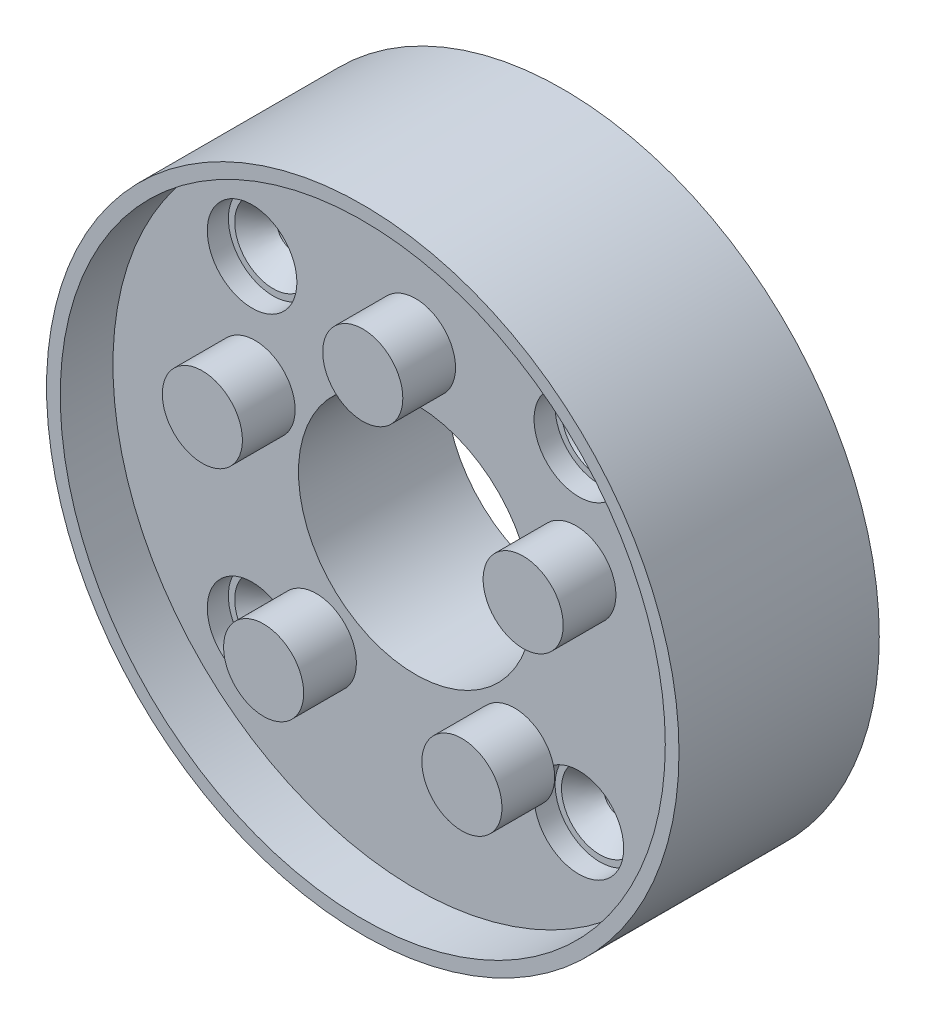
ISO-10303-21;
HEADER;
FILE_DESCRIPTION(('STEP AP214'),'2;1');
FILE_NAME('part.step','',(''),(''),'','','');
FILE_SCHEMA(('AUTOMOTIVE_DESIGN { 1 0 10303 214 1 1 1 1 }'));
ENDSEC;
DATA;
#1=APPLICATION_CONTEXT('core data for automotive mechanical design processes');
#2=APPLICATION_PROTOCOL_DEFINITION('international standard','automotive_design',2000,#1);
#3=PRODUCT_CONTEXT('',#1,'mechanical');
#4=PRODUCT('Part','Part','',(#3));
#5=PRODUCT_RELATED_PRODUCT_CATEGORY('part','',(#4));
#6=PRODUCT_DEFINITION_FORMATION('','',#4);
#7=PRODUCT_DEFINITION_CONTEXT('part definition',#1,'design');
#8=PRODUCT_DEFINITION('design','',#6,#7);
#9=PRODUCT_DEFINITION_SHAPE('','',#8);
#10=(LENGTH_UNIT() NAMED_UNIT(*) SI_UNIT(.MILLI.,.METRE.));
#11=(NAMED_UNIT(*) PLANE_ANGLE_UNIT() SI_UNIT($,.RADIAN.));
#12=(NAMED_UNIT(*) SI_UNIT($,.STERADIAN.) SOLID_ANGLE_UNIT());
#13=UNCERTAINTY_MEASURE_WITH_UNIT(LENGTH_MEASURE(1.E-05),#10,'distance_accuracy_value','');
#14=(GEOMETRIC_REPRESENTATION_CONTEXT(3) GLOBAL_UNCERTAINTY_ASSIGNED_CONTEXT((#13)) GLOBAL_UNIT_ASSIGNED_CONTEXT((#10,
#11,#12)) REPRESENTATION_CONTEXT('',''));
#15=CARTESIAN_POINT('',(0.,0.,0.));
#16=DIRECTION('',(0.,0.,1.));
#17=DIRECTION('',(1.,0.,0.));
#18=AXIS2_PLACEMENT_3D('',#15,#16,#17);
#19=CARTESIAN_POINT('',(-15.5,15.5,14.));
#20=DIRECTION('',(0.,0.,-1.));
#21=DIRECTION('',(-1.,0.,0.));
#22=AXIS2_PLACEMENT_3D('',#19,#20,#21);
#23=CYLINDRICAL_SURFACE('',#22,1.65);
#24=CARTESIAN_POINT('',(-15.5,15.5,10.));
#25=DIRECTION('',(0.,0.,1.));
#26=DIRECTION('',(1.,0.,0.));
#27=AXIS2_PLACEMENT_3D('',#24,#25,#26);
#28=CIRCLE('',#27,1.65);
#29=CARTESIAN_POINT('',(-13.85,15.5,10.));
#30=VERTEX_POINT('',#29);
#31=EDGE_CURVE('E169',#30,#30,#28,.T.);
#32=ORIENTED_EDGE('',*,*,#31,.T.);
#33=EDGE_LOOP('',(#32));
#34=FACE_BOUND('',#33,.T.);
#35=CARTESIAN_POINT('',(-15.5,15.5,0.));
#36=DIRECTION('',(0.,0.,1.));
#37=DIRECTION('',(1.,0.,0.));
#38=AXIS2_PLACEMENT_3D('',#35,#36,#37);
#39=CIRCLE('',#38,1.65);
#40=CARTESIAN_POINT('',(-13.85,15.5,0.));
#41=VERTEX_POINT('',#40);
#42=EDGE_CURVE('E159',#41,#41,#39,.T.);
#43=ORIENTED_EDGE('',*,*,#42,.F.);
#44=EDGE_LOOP('',(#43));
#45=FACE_BOUND('',#44,.T.);
#46=ADVANCED_FACE('F67',(#34,#45),#23,.F.);
#47=CARTESIAN_POINT('',(15.5,15.5000000000009,14.));
#48=DIRECTION('',(0.,0.,-1.));
#49=DIRECTION('',(-1.,0.,0.));
#50=AXIS2_PLACEMENT_3D('',#47,#48,#49);
#51=CYLINDRICAL_SURFACE('',#50,1.65000000000096);
#52=CARTESIAN_POINT('',(15.5,15.5000000000009,9.99999999999999));
#53=DIRECTION('',(0.,0.,1.));
#54=DIRECTION('',(1.,0.,0.));
#55=AXIS2_PLACEMENT_3D('',#52,#53,#54);
#56=CIRCLE('',#55,1.65000000000096);
#57=CARTESIAN_POINT('',(17.150000000001,15.5000000000009,9.99999999999999));
#58=VERTEX_POINT('',#57);
#59=EDGE_CURVE('E76',#58,#58,#56,.T.);
#60=ORIENTED_EDGE('',*,*,#59,.T.);
#61=EDGE_LOOP('',(#60));
#62=FACE_BOUND('',#61,.T.);
#63=CARTESIAN_POINT('',(15.5,15.5000000000009,0.));
#64=DIRECTION('',(0.,0.,1.));
#65=DIRECTION('',(1.,0.,0.));
#66=AXIS2_PLACEMENT_3D('',#63,#64,#65);
#67=CIRCLE('',#66,1.65000000000096);
#68=CARTESIAN_POINT('',(17.150000000001,15.5000000000009,0.));
#69=VERTEX_POINT('',#68);
#70=EDGE_CURVE('E156',#69,#69,#67,.T.);
#71=ORIENTED_EDGE('',*,*,#70,.F.);
#72=EDGE_LOOP('',(#71));
#73=FACE_BOUND('',#72,.T.);
#74=ADVANCED_FACE('F189',(#62,#73),#51,.F.);
#75=CARTESIAN_POINT('',(15.5000000000009,-15.4999999999991,14.));
#76=DIRECTION('',(0.,0.,-1.));
#77=DIRECTION('',(-1.,0.,0.));
#78=AXIS2_PLACEMENT_3D('',#75,#76,#77);
#79=CYLINDRICAL_SURFACE('',#78,1.65000000000129);
#80=CARTESIAN_POINT('',(15.5000000000009,-15.4999999999991,10.));
#81=DIRECTION('',(0.,0.,1.));
#82=DIRECTION('',(1.,0.,0.));
#83=AXIS2_PLACEMENT_3D('',#80,#81,#82);
#84=CIRCLE('',#83,1.65000000000129);
#85=CARTESIAN_POINT('',(17.1500000000022,-15.4999999999991,10.));
#86=VERTEX_POINT('',#85);
#87=EDGE_CURVE('E181',#86,#86,#84,.T.);
#88=ORIENTED_EDGE('',*,*,#87,.T.);
#89=EDGE_LOOP('',(#88));
#90=FACE_BOUND('',#89,.T.);
#91=CARTESIAN_POINT('',(15.5000000000009,-15.4999999999991,0.));
#92=DIRECTION('',(0.,0.,1.));
#93=DIRECTION('',(1.,0.,0.));
#94=AXIS2_PLACEMENT_3D('',#91,#92,#93);
#95=CIRCLE('',#94,1.65000000000129);
#96=CARTESIAN_POINT('',(17.1500000000022,-15.4999999999991,0.));
#97=VERTEX_POINT('',#96);
#98=EDGE_CURVE('E153',#97,#97,#95,.T.);
#99=ORIENTED_EDGE('',*,*,#98,.F.);
#100=EDGE_LOOP('',(#99));
#101=FACE_BOUND('',#100,.T.);
#102=ADVANCED_FACE('F207',(#90,#101),#79,.F.);
#103=CARTESIAN_POINT('',(-15.4999999999991,-15.5,14.));
#104=DIRECTION('',(0.,0.,-1.));
#105=DIRECTION('',(-1.,0.,0.));
#106=AXIS2_PLACEMENT_3D('',#103,#104,#105);
#107=CYLINDRICAL_SURFACE('',#106,1.65000000000051);
#108=CARTESIAN_POINT('',(-15.4999999999991,-15.5,10.));
#109=DIRECTION('',(0.,0.,1.));
#110=DIRECTION('',(1.,0.,0.));
#111=AXIS2_PLACEMENT_3D('',#108,#109,#110);
#112=CIRCLE('',#111,1.65000000000051);
#113=CARTESIAN_POINT('',(-13.8499999999986,-15.5,10.));
#114=VERTEX_POINT('',#113);
#115=EDGE_CURVE('E175',#114,#114,#112,.T.);
#116=ORIENTED_EDGE('',*,*,#115,.T.);
#117=EDGE_LOOP('',(#116));
#118=FACE_BOUND('',#117,.T.);
#119=CARTESIAN_POINT('',(-15.4999999999991,-15.5,0.));
#120=DIRECTION('',(0.,0.,1.));
#121=DIRECTION('',(1.,0.,0.));
#122=AXIS2_PLACEMENT_3D('',#119,#120,#121);
#123=CIRCLE('',#122,1.65000000000051);
#124=CARTESIAN_POINT('',(-13.8499999999986,-15.5,0.));
#125=VERTEX_POINT('',#124);
#126=EDGE_CURVE('E145',#125,#125,#123,.T.);
#127=ORIENTED_EDGE('',*,*,#126,.F.);
#128=EDGE_LOOP('',(#127));
#129=FACE_BOUND('',#128,.T.);
#130=ADVANCED_FACE('F216',(#118,#129),#107,.F.);
#131=CARTESIAN_POINT('',(0.,0.,14.));
#132=DIRECTION('',(0.,0.,-1.));
#133=DIRECTION('',(-1.,0.,0.));
#134=AXIS2_PLACEMENT_3D('',#131,#132,#133);
#135=CYLINDRICAL_SURFACE('',#134,11.1);
#136=CARTESIAN_POINT('',(0.,0.,14.));
#137=DIRECTION('',(0.,0.,1.));
#138=DIRECTION('',(1.,0.,0.));
#139=AXIS2_PLACEMENT_3D('',#136,#137,#138);
#140=CIRCLE('',#139,11.1);
#141=CARTESIAN_POINT('',(11.1,0.,14.));
#142=VERTEX_POINT('',#141);
#143=EDGE_CURVE('E146',#142,#142,#140,.T.);
#144=ORIENTED_EDGE('',*,*,#143,.T.);
#145=EDGE_LOOP('',(#144));
#146=FACE_BOUND('',#145,.T.);
#147=CARTESIAN_POINT('',(0.,0.,0.));
#148=DIRECTION('',(0.,0.,1.));
#149=DIRECTION('',(1.,0.,0.));
#150=AXIS2_PLACEMENT_3D('',#147,#148,#149);
#151=CIRCLE('',#150,11.1);
#152=CARTESIAN_POINT('',(11.1,0.,0.));
#153=VERTEX_POINT('',#152);
#154=EDGE_CURVE('E162',#153,#153,#151,.T.);
#155=ORIENTED_EDGE('',*,*,#154,.F.);
#156=EDGE_LOOP('',(#155));
#157=FACE_BOUND('',#156,.T.);
#158=ADVANCED_FACE('F211',(#146,#157),#135,.F.);
#159=CARTESIAN_POINT('',(0.,0.,14.));
#160=DIRECTION('',(0.,0.,-1.));
#161=DIRECTION('',(-1.,0.,0.));
#162=AXIS2_PLACEMENT_3D('',#159,#160,#161);
#163=CYLINDRICAL_SURFACE('',#162,30.);
#164=CARTESIAN_POINT('',(0.,0.,0.));
#165=DIRECTION('',(0.,0.,1.));
#166=DIRECTION('',(1.,0.,0.));
#167=AXIS2_PLACEMENT_3D('',#164,#165,#166);
#168=CIRCLE('',#167,30.);
#169=CARTESIAN_POINT('',(30.,0.,0.));
#170=VERTEX_POINT('',#169);
#171=EDGE_CURVE('E150',#170,#170,#168,.T.);
#172=ORIENTED_EDGE('',*,*,#171,.T.);
#173=EDGE_LOOP('',(#172));
#174=FACE_BOUND('',#173,.T.);
#175=CARTESIAN_POINT('',(0.,0.,19.));
#176=DIRECTION('',(0.,0.,1.));
#177=DIRECTION('',(1.,0.,0.));
#178=AXIS2_PLACEMENT_3D('',#175,#176,#177);
#179=CIRCLE('',#178,30.);
#180=CARTESIAN_POINT('',(30.,0.,19.));
#181=VERTEX_POINT('',#180);
#182=EDGE_CURVE('E142',#181,#181,#179,.T.);
#183=ORIENTED_EDGE('',*,*,#182,.F.);
#184=EDGE_LOOP('',(#183));
#185=FACE_BOUND('',#184,.T.);
#186=ADVANCED_FACE('F262',(#174,#185),#163,.T.);
#187=CARTESIAN_POINT('',(0.,0.,14.));
#188=DIRECTION('',(0.,0.,1.));
#189=DIRECTION('',(1.,0.,0.));
#190=AXIS2_PLACEMENT_3D('',#187,#188,#189);
#191=PLANE('',#190);
#192=CARTESIAN_POINT('',(-15.4999999999991,-15.5,14.));
#193=DIRECTION('',(0.,0.,1.));
#194=DIRECTION('',(1.,0.,0.));
#195=AXIS2_PLACEMENT_3D('',#192,#193,#194);
#196=CIRCLE('',#195,4.25);
#197=CARTESIAN_POINT('',(-13.0859302014267,-12.0021768187027,14.));
#198=VERTEX_POINT('',#197);
#199=CARTESIAN_POINT('',(-11.313193339791,-16.2301712059762,14.));
#200=VERTEX_POINT('',#199);
#201=EDGE_CURVE('E89',#198,#200,#196,.T.);
#202=ORIENTED_EDGE('',*,*,#201,.F.);
#203=CARTESIAN_POINT('',(-9.40456403667834,-12.9442719099996,14.));
#204=DIRECTION('',(0.,0.,1.));
#205=DIRECTION('',(1.,0.,0.));
#206=AXIS2_PLACEMENT_3D('',#203,#204,#205);
#207=CIRCLE('',#206,3.8);
#208=EDGE_CURVE('E104',#200,#198,#207,.T.);
#209=ORIENTED_EDGE('',*,*,#208,.F.);
#210=EDGE_LOOP('',(#202,#209));
#211=FACE_BOUND('',#210,.T.);
#212=CARTESIAN_POINT('',(15.5000000000009,-15.4999999999991,14.));
#213=DIRECTION('',(0.,0.,1.));
#214=DIRECTION('',(1.,0.,0.));
#215=AXIS2_PLACEMENT_3D('',#212,#213,#214);
#216=CIRCLE('',#215,4.25);
#217=CARTESIAN_POINT('',(11.3131933397928,-16.2301712059758,14.));
#218=VERTEX_POINT('',#217);
#219=CARTESIAN_POINT('',(13.0859302014291,-12.0021768187014,14.));
#220=VERTEX_POINT('',#219);
#221=EDGE_CURVE('E566',#218,#220,#216,.T.);
#222=ORIENTED_EDGE('',*,*,#221,.F.);
#223=CARTESIAN_POINT('',(9.4045640366808,-12.9442719099988,14.));
#224=DIRECTION('',(0.,0.,1.));
#225=DIRECTION('',(1.,0.,0.));
#226=AXIS2_PLACEMENT_3D('',#223,#224,#225);
#227=CIRCLE('',#226,3.8);
#228=EDGE_CURVE('E121',#220,#218,#227,.T.);
#229=ORIENTED_EDGE('',*,*,#228,.F.);
#230=EDGE_LOOP('',(#222,#229));
#231=FACE_BOUND('',#230,.T.);
#232=CARTESIAN_POINT('',(15.5,15.5000000000008,14.));
#233=DIRECTION('',(0.,0.,1.));
#234=DIRECTION('',(1.,0.,0.));
#235=AXIS2_PLACEMENT_3D('',#232,#233,#234);
#236=CIRCLE('',#235,4.25);
#237=CARTESIAN_POINT('',(19.75,15.5000000000008,14.));
#238=VERTEX_POINT('',#237);
#239=EDGE_CURVE('E599',#238,#238,#236,.T.);
#240=ORIENTED_EDGE('',*,*,#239,.F.);
#241=EDGE_LOOP('',(#240));
#242=FACE_BOUND('',#241,.T.);
#243=CARTESIAN_POINT('',(-15.5,15.5,14.));
#244=DIRECTION('',(0.,0.,1.));
#245=DIRECTION('',(1.,0.,0.));
#246=AXIS2_PLACEMENT_3D('',#243,#244,#245);
#247=CIRCLE('',#246,4.25);
#248=CARTESIAN_POINT('',(-11.25,15.5,14.));
#249=VERTEX_POINT('',#248);
#250=EDGE_CURVE('E578',#249,#249,#247,.T.);
#251=ORIENTED_EDGE('',*,*,#250,.F.);
#252=EDGE_LOOP('',(#251));
#253=FACE_BOUND('',#252,.T.);
#254=CARTESIAN_POINT('',(15.2169042607229,4.94427190999981,14.));
#255=DIRECTION('',(0.,0.,1.));
#256=DIRECTION('',(1.,0.,0.));
#257=AXIS2_PLACEMENT_3D('',#254,#255,#256);
#258=CIRCLE('',#257,3.8);
#259=CARTESIAN_POINT('',(19.0169042607229,4.94427190999981,14.));
#260=VERTEX_POINT('',#259);
#261=EDGE_CURVE('E115',#260,#260,#258,.T.);
#262=ORIENTED_EDGE('',*,*,#261,.F.);
#263=EDGE_LOOP('',(#262));
#264=FACE_BOUND('',#263,.T.);
#265=CARTESIAN_POINT('',(0.,16.,14.));
#266=DIRECTION('',(0.,0.,1.));
#267=DIRECTION('',(1.,0.,0.));
#268=AXIS2_PLACEMENT_3D('',#265,#266,#267);
#269=CIRCLE('',#268,3.8);
#270=CARTESIAN_POINT('',(3.8,16.,14.));
#271=VERTEX_POINT('',#270);
#272=EDGE_CURVE('E128',#271,#271,#269,.T.);
#273=ORIENTED_EDGE('',*,*,#272,.F.);
#274=EDGE_LOOP('',(#273));
#275=FACE_BOUND('',#274,.T.);
#276=CARTESIAN_POINT('',(-15.216904260722,4.94427190999851,14.));
#277=DIRECTION('',(0.,0.,1.));
#278=DIRECTION('',(1.,0.,0.));
#279=AXIS2_PLACEMENT_3D('',#276,#277,#278);
#280=CIRCLE('',#279,3.8);
#281=CARTESIAN_POINT('',(-11.416904260722,4.94427190999851,14.));
#282=VERTEX_POINT('',#281);
#283=EDGE_CURVE('E134',#282,#282,#280,.T.);
#284=ORIENTED_EDGE('',*,*,#283,.F.);
#285=EDGE_LOOP('',(#284));
#286=FACE_BOUND('',#285,.T.);
#287=CARTESIAN_POINT('',(0.,0.,14.));
#288=DIRECTION('',(0.,0.,1.));
#289=DIRECTION('',(1.,0.,0.));
#290=AXIS2_PLACEMENT_3D('',#287,#288,#289);
#291=CIRCLE('',#290,28.7);
#292=CARTESIAN_POINT('',(28.7,0.,14.));
#293=VERTEX_POINT('',#292);
#294=EDGE_CURVE('E149',#293,#293,#291,.F.);
#295=ORIENTED_EDGE('',*,*,#294,.F.);
#296=EDGE_LOOP('',(#295));
#297=FACE_BOUND('',#296,.T.);
#298=ORIENTED_EDGE('',*,*,#143,.F.);
#299=EDGE_LOOP('',(#298));
#300=FACE_BOUND('',#299,.T.);
#301=ADVANCED_FACE('F109',(#211,#231,#242,#253,#264,#275,#286,#297,#300),#191,.T.);
#302=CARTESIAN_POINT('',(0.,0.,0.));
#303=DIRECTION('',(0.,0.,1.));
#304=DIRECTION('',(1.,0.,0.));
#305=AXIS2_PLACEMENT_3D('',#302,#303,#304);
#306=PLANE('',#305);
#307=ORIENTED_EDGE('',*,*,#126,.T.);
#308=EDGE_LOOP('',(#307));
#309=FACE_BOUND('',#308,.T.);
#310=ORIENTED_EDGE('',*,*,#98,.T.);
#311=EDGE_LOOP('',(#310));
#312=FACE_BOUND('',#311,.T.);
#313=ORIENTED_EDGE('',*,*,#70,.T.);
#314=EDGE_LOOP('',(#313));
#315=FACE_BOUND('',#314,.T.);
#316=ORIENTED_EDGE('',*,*,#42,.T.);
#317=EDGE_LOOP('',(#316));
#318=FACE_BOUND('',#317,.T.);
#319=ORIENTED_EDGE('',*,*,#154,.T.);
#320=EDGE_LOOP('',(#319));
#321=FACE_BOUND('',#320,.T.);
#322=ORIENTED_EDGE('',*,*,#171,.F.);
#323=EDGE_LOOP('',(#322));
#324=FACE_BOUND('',#323,.T.);
#325=ADVANCED_FACE('F247',(#309,#312,#315,#318,#321,#324),#306,.F.);
#326=CARTESIAN_POINT('',(0.,0.,19.));
#327=DIRECTION('',(0.,0.,-1.));
#328=DIRECTION('',(-1.,0.,0.));
#329=AXIS2_PLACEMENT_3D('',#326,#327,#328);
#330=CYLINDRICAL_SURFACE('',#329,28.7);
#331=CARTESIAN_POINT('',(0.,0.,19.));
#332=DIRECTION('',(0.,0.,1.));
#333=DIRECTION('',(1.,0.,0.));
#334=AXIS2_PLACEMENT_3D('',#331,#332,#333);
#335=CIRCLE('',#334,28.7);
#336=CARTESIAN_POINT('',(28.7,0.,19.));
#337=VERTEX_POINT('',#336);
#338=EDGE_CURVE('E137',#337,#337,#335,.T.);
#339=ORIENTED_EDGE('',*,*,#338,.T.);
#340=EDGE_LOOP('',(#339));
#341=FACE_BOUND('',#340,.T.);
#342=ORIENTED_EDGE('',*,*,#294,.T.);
#343=EDGE_LOOP('',(#342));
#344=FACE_BOUND('',#343,.T.);
#345=ADVANCED_FACE('F250',(#341,#344),#330,.F.);
#346=CARTESIAN_POINT('',(0.,0.,19.));
#347=DIRECTION('',(0.,0.,1.));
#348=DIRECTION('',(1.,0.,0.));
#349=AXIS2_PLACEMENT_3D('',#346,#347,#348);
#350=PLANE('',#349);
#351=ORIENTED_EDGE('',*,*,#338,.F.);
#352=EDGE_LOOP('',(#351));
#353=FACE_BOUND('',#352,.T.);
#354=ORIENTED_EDGE('',*,*,#182,.T.);
#355=EDGE_LOOP('',(#354));
#356=FACE_BOUND('',#355,.T.);
#357=ADVANCED_FACE('F267',(#353,#356),#350,.T.);
#358=CARTESIAN_POINT('',(-15.216904260722,4.94427190999851,19.));
#359=DIRECTION('',(0.,0.,-1.));
#360=DIRECTION('',(-1.,0.,0.));
#361=AXIS2_PLACEMENT_3D('',#358,#359,#360);
#362=CYLINDRICAL_SURFACE('',#361,3.8);
#363=CARTESIAN_POINT('',(-15.216904260722,4.94427190999851,19.));
#364=DIRECTION('',(0.,0.,1.));
#365=DIRECTION('',(1.,0.,0.));
#366=AXIS2_PLACEMENT_3D('',#363,#364,#365);
#367=CIRCLE('',#366,3.8);
#368=CARTESIAN_POINT('',(-11.416904260722,4.94427190999851,19.));
#369=VERTEX_POINT('',#368);
#370=EDGE_CURVE('E131',#369,#369,#367,.T.);
#371=ORIENTED_EDGE('',*,*,#370,.F.);
#372=EDGE_LOOP('',(#371));
#373=FACE_BOUND('',#372,.T.);
#374=ORIENTED_EDGE('',*,*,#283,.T.);
#375=EDGE_LOOP('',(#374));
#376=FACE_BOUND('',#375,.T.);
#377=ADVANCED_FACE('F269',(#373,#376),#362,.T.);
#378=CARTESIAN_POINT('',(0.,0.,19.));
#379=DIRECTION('',(0.,0.,1.));
#380=DIRECTION('',(1.,0.,0.));
#381=AXIS2_PLACEMENT_3D('',#378,#379,#380);
#382=PLANE('',#381);
#383=ORIENTED_EDGE('',*,*,#370,.T.);
#384=EDGE_LOOP('',(#383));
#385=FACE_BOUND('',#384,.T.);
#386=ADVANCED_FACE('F276',(#385),#382,.T.);
#387=CARTESIAN_POINT('',(0.,16.,19.));
#388=DIRECTION('',(0.,0.,-1.));
#389=DIRECTION('',(-1.,0.,0.));
#390=AXIS2_PLACEMENT_3D('',#387,#388,#389);
#391=CYLINDRICAL_SURFACE('',#390,3.8);
#392=CARTESIAN_POINT('',(0.,16.,19.));
#393=DIRECTION('',(0.,0.,1.));
#394=DIRECTION('',(1.,0.,0.));
#395=AXIS2_PLACEMENT_3D('',#392,#393,#394);
#396=CIRCLE('',#395,3.8);
#397=CARTESIAN_POINT('',(3.8,16.,19.));
#398=VERTEX_POINT('',#397);
#399=EDGE_CURVE('E124',#398,#398,#396,.T.);
#400=ORIENTED_EDGE('',*,*,#399,.F.);
#401=EDGE_LOOP('',(#400));
#402=FACE_BOUND('',#401,.T.);
#403=ORIENTED_EDGE('',*,*,#272,.T.);
#404=EDGE_LOOP('',(#403));
#405=FACE_BOUND('',#404,.T.);
#406=ADVANCED_FACE('F322',(#402,#405),#391,.T.);
#407=CARTESIAN_POINT('',(0.,0.,19.));
#408=DIRECTION('',(0.,0.,1.));
#409=DIRECTION('',(1.,0.,0.));
#410=AXIS2_PLACEMENT_3D('',#407,#408,#409);
#411=PLANE('',#410);
#412=ORIENTED_EDGE('',*,*,#399,.T.);
#413=EDGE_LOOP('',(#412));
#414=FACE_BOUND('',#413,.T.);
#415=ADVANCED_FACE('F331',(#414),#411,.T.);
#416=CARTESIAN_POINT('',(9.4045640366808,-12.9442719099988,19.));
#417=DIRECTION('',(0.,0.,-1.));
#418=DIRECTION('',(-1.,0.,0.));
#419=AXIS2_PLACEMENT_3D('',#416,#417,#418);
#420=CYLINDRICAL_SURFACE('',#419,3.8);
#421=CARTESIAN_POINT('',(9.4045640366808,-12.9442719099988,19.));
#422=DIRECTION('',(0.,0.,1.));
#423=DIRECTION('',(1.,0.,0.));
#424=AXIS2_PLACEMENT_3D('',#421,#422,#423);
#425=CIRCLE('',#424,3.8);
#426=CARTESIAN_POINT('',(13.2045640366808,-12.9442719099988,19.));
#427=VERTEX_POINT('',#426);
#428=EDGE_CURVE('E103',#427,#427,#425,.T.);
#429=ORIENTED_EDGE('',*,*,#428,.F.);
#430=EDGE_LOOP('',(#429));
#431=FACE_BOUND('',#430,.T.);
#432=ORIENTED_EDGE('',*,*,#228,.T.);
#433=EDGE_CURVE('E125',#218,#220,#227,.T.);
#434=ORIENTED_EDGE('',*,*,#433,.T.);
#435=EDGE_LOOP('',(#432,#434));
#436=FACE_BOUND('',#435,.T.);
#437=ADVANCED_FACE('F341',(#431,#436),#420,.T.);
#438=CARTESIAN_POINT('',(0.,0.,19.));
#439=DIRECTION('',(0.,0.,1.));
#440=DIRECTION('',(1.,0.,0.));
#441=AXIS2_PLACEMENT_3D('',#438,#439,#440);
#442=PLANE('',#441);
#443=ORIENTED_EDGE('',*,*,#428,.T.);
#444=EDGE_LOOP('',(#443));
#445=FACE_BOUND('',#444,.T.);
#446=ADVANCED_FACE('F349',(#445),#442,.T.);
#447=CARTESIAN_POINT('',(-9.40456403667834,-12.9442719099996,19.));
#448=DIRECTION('',(0.,0.,-1.));
#449=DIRECTION('',(-1.,0.,0.));
#450=AXIS2_PLACEMENT_3D('',#447,#448,#449);
#451=CYLINDRICAL_SURFACE('',#450,3.8);
#452=CARTESIAN_POINT('',(-9.40456403667834,-12.9442719099996,19.));
#453=DIRECTION('',(0.,0.,1.));
#454=DIRECTION('',(1.,0.,0.));
#455=AXIS2_PLACEMENT_3D('',#452,#453,#454);
#456=CIRCLE('',#455,3.8);
#457=CARTESIAN_POINT('',(-5.60456403667835,-12.9442719099996,19.));
#458=VERTEX_POINT('',#457);
#459=EDGE_CURVE('E113',#458,#458,#456,.T.);
#460=ORIENTED_EDGE('',*,*,#459,.F.);
#461=EDGE_LOOP('',(#460));
#462=FACE_BOUND('',#461,.T.);
#463=EDGE_CURVE('E97',#198,#200,#207,.T.);
#464=ORIENTED_EDGE('',*,*,#463,.T.);
#465=ORIENTED_EDGE('',*,*,#208,.T.);
#466=EDGE_LOOP('',(#464,#465));
#467=FACE_BOUND('',#466,.T.);
#468=ADVANCED_FACE('F112',(#462,#467),#451,.T.);
#469=CARTESIAN_POINT('',(0.,0.,19.));
#470=DIRECTION('',(0.,0.,1.));
#471=DIRECTION('',(1.,0.,0.));
#472=AXIS2_PLACEMENT_3D('',#469,#470,#471);
#473=PLANE('',#472);
#474=ORIENTED_EDGE('',*,*,#459,.T.);
#475=EDGE_LOOP('',(#474));
#476=FACE_BOUND('',#475,.T.);
#477=ADVANCED_FACE('F361',(#476),#473,.T.);
#478=CARTESIAN_POINT('',(15.2169042607229,4.94427190999981,19.));
#479=DIRECTION('',(0.,0.,-1.));
#480=DIRECTION('',(-1.,0.,0.));
#481=AXIS2_PLACEMENT_3D('',#478,#479,#480);
#482=CYLINDRICAL_SURFACE('',#481,3.8);
#483=CARTESIAN_POINT('',(15.2169042607229,4.94427190999981,19.));
#484=DIRECTION('',(0.,0.,1.));
#485=DIRECTION('',(1.,0.,0.));
#486=AXIS2_PLACEMENT_3D('',#483,#484,#485);
#487=CIRCLE('',#486,3.8);
#488=CARTESIAN_POINT('',(19.0169042607229,4.94427190999981,19.));
#489=VERTEX_POINT('',#488);
#490=EDGE_CURVE('E118',#489,#489,#487,.T.);
#491=ORIENTED_EDGE('',*,*,#490,.F.);
#492=EDGE_LOOP('',(#491));
#493=FACE_BOUND('',#492,.T.);
#494=ORIENTED_EDGE('',*,*,#261,.T.);
#495=EDGE_LOOP('',(#494));
#496=FACE_BOUND('',#495,.T.);
#497=ADVANCED_FACE('F366',(#493,#496),#482,.T.);
#498=CARTESIAN_POINT('',(15.2169042607229,4.94427190999981,19.));
#499=DIRECTION('',(0.,0.,1.));
#500=DIRECTION('',(1.,0.,0.));
#501=AXIS2_PLACEMENT_3D('',#498,#499,#500);
#502=PLANE('',#501);
#503=ORIENTED_EDGE('',*,*,#490,.T.);
#504=EDGE_LOOP('',(#503));
#505=FACE_BOUND('',#504,.T.);
#506=ADVANCED_FACE('F375',(#505),#502,.T.);
#507=CARTESIAN_POINT('',(-15.4999999999991,-15.5,14.));
#508=DIRECTION('',(0.,0.,1.));
#509=DIRECTION('',(1.,0.,0.));
#510=AXIS2_PLACEMENT_3D('',#507,#508,#509);
#511=PLANE('',#510);
#512=EDGE_CURVE('E99',#200,#198,#196,.T.);
#513=ORIENTED_EDGE('',*,*,#512,.F.);
#514=ORIENTED_EDGE('',*,*,#463,.F.);
#515=EDGE_LOOP('',(#513,#514));
#516=FACE_BOUND('',#515,.T.);
#517=ADVANCED_FACE('F98',(#516),#511,.F.);
#518=CARTESIAN_POINT('',(-15.4999999999991,-15.5,12.));
#519=DIRECTION('',(0.,0.,1.));
#520=DIRECTION('',(1.,0.,0.));
#521=AXIS2_PLACEMENT_3D('',#518,#519,#520);
#522=CYLINDRICAL_SURFACE('',#521,4.25);
#523=CARTESIAN_POINT('',(-15.4999999999991,-15.5,12.));
#524=DIRECTION('',(0.,0.,1.));
#525=DIRECTION('',(1.,0.,0.));
#526=AXIS2_PLACEMENT_3D('',#523,#524,#525);
#527=CIRCLE('',#526,4.25);
#528=CARTESIAN_POINT('',(-11.2499999999991,-15.5,12.));
#529=VERTEX_POINT('',#528);
#530=EDGE_CURVE('E111',#529,#529,#527,.T.);
#531=ORIENTED_EDGE('',*,*,#530,.F.);
#532=EDGE_LOOP('',(#531));
#533=FACE_BOUND('',#532,.T.);
#534=ORIENTED_EDGE('',*,*,#201,.T.);
#535=ORIENTED_EDGE('',*,*,#512,.T.);
#536=EDGE_LOOP('',(#534,#535));
#537=FACE_BOUND('',#536,.T.);
#538=ADVANCED_FACE('F106',(#533,#537),#522,.F.);
#539=CARTESIAN_POINT('',(-15.4999999999991,-15.5,12.));
#540=DIRECTION('',(0.,0.,1.));
#541=DIRECTION('',(1.,0.,0.));
#542=AXIS2_PLACEMENT_3D('',#539,#540,#541);
#543=PLANE('',#542);
#544=CARTESIAN_POINT('',(-15.4999999999991,-15.5,12.));
#545=DIRECTION('',(0.,0.,1.));
#546=DIRECTION('',(1.,0.,0.));
#547=AXIS2_PLACEMENT_3D('',#544,#545,#546);
#548=CIRCLE('',#547,3.65000000000051);
#549=CARTESIAN_POINT('',(-11.8499999999986,-15.5,12.));
#550=VERTEX_POINT('',#549);
#551=EDGE_CURVE('E178',#550,#550,#548,.F.);
#552=ORIENTED_EDGE('',*,*,#551,.T.);
#553=EDGE_LOOP('',(#552));
#554=FACE_BOUND('',#553,.T.);
#555=ORIENTED_EDGE('',*,*,#530,.T.);
#556=EDGE_LOOP('',(#555));
#557=FACE_BOUND('',#556,.T.);
#558=ADVANCED_FACE('F401',(#554,#557),#543,.T.);
#559=CARTESIAN_POINT('',(15.5000000000009,-15.4999999999991,14.));
#560=DIRECTION('',(0.,0.,1.));
#561=DIRECTION('',(1.,0.,0.));
#562=AXIS2_PLACEMENT_3D('',#559,#560,#561);
#563=PLANE('',#562);
#564=EDGE_CURVE('E82',#220,#218,#216,.T.);
#565=ORIENTED_EDGE('',*,*,#564,.F.);
#566=ORIENTED_EDGE('',*,*,#433,.F.);
#567=EDGE_LOOP('',(#565,#566));
#568=FACE_BOUND('',#567,.T.);
#569=ADVANCED_FACE('F410',(#568),#563,.F.);
#570=CARTESIAN_POINT('',(15.5000000000009,-15.4999999999991,12.));
#571=DIRECTION('',(0.,0.,1.));
#572=DIRECTION('',(1.,0.,0.));
#573=AXIS2_PLACEMENT_3D('',#570,#571,#572);
#574=CYLINDRICAL_SURFACE('',#573,4.25);
#575=CARTESIAN_POINT('',(15.5000000000009,-15.4999999999991,12.));
#576=DIRECTION('',(0.,0.,1.));
#577=DIRECTION('',(1.,0.,0.));
#578=AXIS2_PLACEMENT_3D('',#575,#576,#577);
#579=CIRCLE('',#578,4.25);
#580=CARTESIAN_POINT('',(19.7500000000008,-15.4999999999991,12.));
#581=VERTEX_POINT('',#580);
#582=EDGE_CURVE('E569',#581,#581,#579,.T.);
#583=ORIENTED_EDGE('',*,*,#582,.F.);
#584=EDGE_LOOP('',(#583));
#585=FACE_BOUND('',#584,.T.);
#586=ORIENTED_EDGE('',*,*,#564,.T.);
#587=ORIENTED_EDGE('',*,*,#221,.T.);
#588=EDGE_LOOP('',(#586,#587));
#589=FACE_BOUND('',#588,.T.);
#590=ADVANCED_FACE('F419',(#585,#589),#574,.F.);
#591=CARTESIAN_POINT('',(15.5000000000009,-15.4999999999991,12.));
#592=DIRECTION('',(0.,0.,1.));
#593=DIRECTION('',(1.,0.,0.));
#594=AXIS2_PLACEMENT_3D('',#591,#592,#593);
#595=PLANE('',#594);
#596=CARTESIAN_POINT('',(15.5000000000009,-15.4999999999991,12.));
#597=DIRECTION('',(0.,0.,1.));
#598=DIRECTION('',(1.,0.,0.));
#599=AXIS2_PLACEMENT_3D('',#596,#597,#598);
#600=CIRCLE('',#599,3.65000000000128);
#601=CARTESIAN_POINT('',(19.1500000000022,-15.4999999999991,12.));
#602=VERTEX_POINT('',#601);
#603=EDGE_CURVE('E184',#602,#602,#600,.F.);
#604=ORIENTED_EDGE('',*,*,#603,.T.);
#605=EDGE_LOOP('',(#604));
#606=FACE_BOUND('',#605,.T.);
#607=ORIENTED_EDGE('',*,*,#582,.T.);
#608=EDGE_LOOP('',(#607));
#609=FACE_BOUND('',#608,.T.);
#610=ADVANCED_FACE('F426',(#606,#609),#595,.T.);
#611=CARTESIAN_POINT('',(-15.5,15.5,12.));
#612=DIRECTION('',(0.,0.,1.));
#613=DIRECTION('',(1.,0.,0.));
#614=AXIS2_PLACEMENT_3D('',#611,#612,#613);
#615=CYLINDRICAL_SURFACE('',#614,4.25);
#616=CARTESIAN_POINT('',(-15.5,15.5,12.));
#617=DIRECTION('',(0.,0.,1.));
#618=DIRECTION('',(1.,0.,0.));
#619=AXIS2_PLACEMENT_3D('',#616,#617,#618);
#620=CIRCLE('',#619,4.25);
#621=CARTESIAN_POINT('',(-11.25,15.5,12.));
#622=VERTEX_POINT('',#621);
#623=EDGE_CURVE('E575',#622,#622,#620,.T.);
#624=ORIENTED_EDGE('',*,*,#623,.F.);
#625=EDGE_LOOP('',(#624));
#626=FACE_BOUND('',#625,.T.);
#627=ORIENTED_EDGE('',*,*,#250,.T.);
#628=EDGE_LOOP('',(#627));
#629=FACE_BOUND('',#628,.T.);
#630=ADVANCED_FACE('F434',(#626,#629),#615,.F.);
#631=CARTESIAN_POINT('',(-15.5,15.5,12.));
#632=DIRECTION('',(0.,0.,1.));
#633=DIRECTION('',(1.,0.,0.));
#634=AXIS2_PLACEMENT_3D('',#631,#632,#633);
#635=PLANE('',#634);
#636=CARTESIAN_POINT('',(-15.5,15.5,12.));
#637=DIRECTION('',(0.,0.,1.));
#638=DIRECTION('',(1.,0.,0.));
#639=AXIS2_PLACEMENT_3D('',#636,#637,#638);
#640=CIRCLE('',#639,3.64999999999999);
#641=CARTESIAN_POINT('',(-11.85,15.5,12.));
#642=VERTEX_POINT('',#641);
#643=EDGE_CURVE('E172',#642,#642,#640,.F.);
#644=ORIENTED_EDGE('',*,*,#643,.T.);
#645=EDGE_LOOP('',(#644));
#646=FACE_BOUND('',#645,.T.);
#647=ORIENTED_EDGE('',*,*,#623,.T.);
#648=EDGE_LOOP('',(#647));
#649=FACE_BOUND('',#648,.T.);
#650=ADVANCED_FACE('F442',(#646,#649),#635,.T.);
#651=CARTESIAN_POINT('',(15.5,15.5000000000008,12.));
#652=DIRECTION('',(0.,0.,1.));
#653=DIRECTION('',(1.,0.,0.));
#654=AXIS2_PLACEMENT_3D('',#651,#652,#653);
#655=CYLINDRICAL_SURFACE('',#654,4.25);
#656=CARTESIAN_POINT('',(15.5,15.5000000000008,12.));
#657=DIRECTION('',(0.,0.,1.));
#658=DIRECTION('',(1.,0.,0.));
#659=AXIS2_PLACEMENT_3D('',#656,#657,#658);
#660=CIRCLE('',#659,4.25);
#661=CARTESIAN_POINT('',(19.75,15.5000000000008,12.));
#662=VERTEX_POINT('',#661);
#663=EDGE_CURVE('E580',#662,#662,#660,.T.);
#664=ORIENTED_EDGE('',*,*,#663,.F.);
#665=EDGE_LOOP('',(#664));
#666=FACE_BOUND('',#665,.T.);
#667=ORIENTED_EDGE('',*,*,#239,.T.);
#668=EDGE_LOOP('',(#667));
#669=FACE_BOUND('',#668,.T.);
#670=ADVANCED_FACE('F450',(#666,#669),#655,.F.);
#671=CARTESIAN_POINT('',(15.5,15.5000000000008,12.));
#672=DIRECTION('',(0.,0.,1.));
#673=DIRECTION('',(1.,0.,0.));
#674=AXIS2_PLACEMENT_3D('',#671,#672,#673);
#675=PLANE('',#674);
#676=CARTESIAN_POINT('',(15.5,15.5000000000009,12.));
#677=DIRECTION('',(0.,0.,1.));
#678=DIRECTION('',(1.,0.,0.));
#679=AXIS2_PLACEMENT_3D('',#676,#677,#678);
#680=CIRCLE('',#679,3.65000000000097);
#681=CARTESIAN_POINT('',(19.150000000001,15.5000000000009,12.));
#682=VERTEX_POINT('',#681);
#683=EDGE_CURVE('E12',#682,#682,#680,.F.);
#684=ORIENTED_EDGE('',*,*,#683,.T.);
#685=EDGE_LOOP('',(#684));
#686=FACE_BOUND('',#685,.T.);
#687=ORIENTED_EDGE('',*,*,#663,.T.);
#688=EDGE_LOOP('',(#687));
#689=FACE_BOUND('',#688,.T.);
#690=ADVANCED_FACE('F228',(#686,#689),#675,.T.);
#691=CARTESIAN_POINT('',(-15.5,15.5,10.));
#692=DIRECTION('',(0.,0.,1.));
#693=DIRECTION('',(1.,0.,0.));
#694=AXIS2_PLACEMENT_3D('',#691,#692,#693);
#695=CONICAL_SURFACE('',#694,1.65,0.78539816339745);
#696=ORIENTED_EDGE('',*,*,#643,.F.);
#697=EDGE_LOOP('',(#696));
#698=FACE_BOUND('',#697,.T.);
#699=ORIENTED_EDGE('',*,*,#31,.F.);
#700=EDGE_LOOP('',(#699));
#701=FACE_BOUND('',#700,.T.);
#702=ADVANCED_FACE('F222',(#698,#701),#695,.F.);
#703=CARTESIAN_POINT('',(-15.4999999999991,-15.5,10.));
#704=DIRECTION('',(0.,0.,1.));
#705=DIRECTION('',(1.,0.,0.));
#706=AXIS2_PLACEMENT_3D('',#703,#704,#705);
#707=CONICAL_SURFACE('',#706,1.65000000000051,0.78539816339745);
#708=ORIENTED_EDGE('',*,*,#551,.F.);
#709=EDGE_LOOP('',(#708));
#710=FACE_BOUND('',#709,.T.);
#711=ORIENTED_EDGE('',*,*,#115,.F.);
#712=EDGE_LOOP('',(#711));
#713=FACE_BOUND('',#712,.T.);
#714=ADVANCED_FACE('F198',(#710,#713),#707,.F.);
#715=CARTESIAN_POINT('',(15.5000000000009,-15.4999999999991,10.));
#716=DIRECTION('',(0.,0.,1.));
#717=DIRECTION('',(1.,0.,0.));
#718=AXIS2_PLACEMENT_3D('',#715,#716,#717);
#719=CONICAL_SURFACE('',#718,1.65000000000129,0.78539816339745);
#720=ORIENTED_EDGE('',*,*,#603,.F.);
#721=EDGE_LOOP('',(#720));
#722=FACE_BOUND('',#721,.T.);
#723=ORIENTED_EDGE('',*,*,#87,.F.);
#724=EDGE_LOOP('',(#723));
#725=FACE_BOUND('',#724,.T.);
#726=ADVANCED_FACE('F193',(#722,#725),#719,.F.);
#727=CARTESIAN_POINT('',(15.5,15.5000000000009,9.99999999999999));
#728=DIRECTION('',(0.,0.,1.));
#729=DIRECTION('',(1.,0.,0.));
#730=AXIS2_PLACEMENT_3D('',#727,#728,#729);
#731=CONICAL_SURFACE('',#730,1.65000000000096,0.78539816339745);
#732=ORIENTED_EDGE('',*,*,#683,.F.);
#733=EDGE_LOOP('',(#732));
#734=FACE_BOUND('',#733,.T.);
#735=ORIENTED_EDGE('',*,*,#59,.F.);
#736=EDGE_LOOP('',(#735));
#737=FACE_BOUND('',#736,.T.);
#738=ADVANCED_FACE('F70',(#734,#737),#731,.F.);
#739=CLOSED_SHELL('',(#46,#74,#102,#130,#158,#186,#301,#325,#345,#357,#377,#386,#406,#415,#437,
#446,#468,#477,#497,#506,#517,#538,#558,#569,#590,#610,#630,#650,#670,#690,#702,#714,#726,#738));
#740=MANIFOLD_SOLID_BREP('B2',#739);
#741=ADVANCED_BREP_SHAPE_REPRESENTATION('',(#18,#740),#14);
#742=SHAPE_DEFINITION_REPRESENTATION(#9,#741);
ENDSEC;
END-ISO-10303-21;
